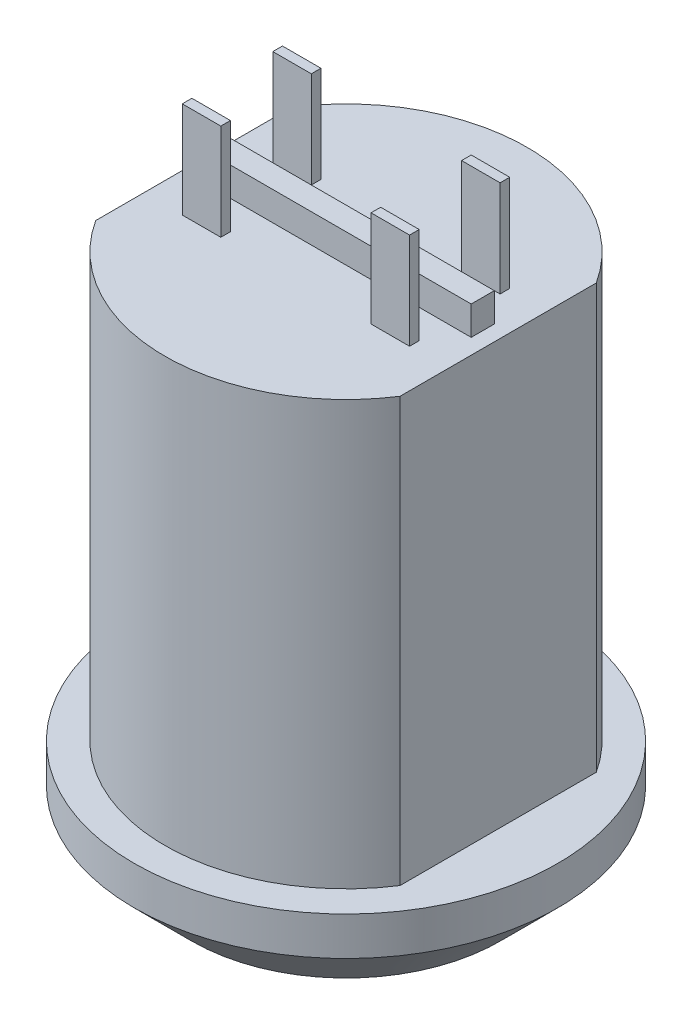
ISO-10303-21;
HEADER;
FILE_DESCRIPTION(('STEP AP214'),'2;1');
FILE_NAME('part.step','',(''),(''),'','','');
FILE_SCHEMA(('AUTOMOTIVE_DESIGN { 1 0 10303 214 1 1 1 1 }'));
ENDSEC;
DATA;
#1=APPLICATION_CONTEXT('core data for automotive mechanical design processes');
#2=APPLICATION_PROTOCOL_DEFINITION('international standard','automotive_design',2000,#1);
#3=PRODUCT_CONTEXT('',#1,'mechanical');
#4=PRODUCT('Part','Part','',(#3));
#5=PRODUCT_RELATED_PRODUCT_CATEGORY('part','',(#4));
#6=PRODUCT_DEFINITION_FORMATION('','',#4);
#7=PRODUCT_DEFINITION_CONTEXT('part definition',#1,'design');
#8=PRODUCT_DEFINITION('design','',#6,#7);
#9=PRODUCT_DEFINITION_SHAPE('','',#8);
#10=(LENGTH_UNIT() NAMED_UNIT(*) SI_UNIT(.MILLI.,.METRE.));
#11=(NAMED_UNIT(*) PLANE_ANGLE_UNIT() SI_UNIT($,.RADIAN.));
#12=(NAMED_UNIT(*) SI_UNIT($,.STERADIAN.) SOLID_ANGLE_UNIT());
#13=UNCERTAINTY_MEASURE_WITH_UNIT(LENGTH_MEASURE(1.E-05),#10,'distance_accuracy_value','');
#14=(GEOMETRIC_REPRESENTATION_CONTEXT(3) GLOBAL_UNCERTAINTY_ASSIGNED_CONTEXT((#13)) GLOBAL_UNIT_ASSIGNED_CONTEXT((#10,
#11,#12)) REPRESENTATION_CONTEXT('',''));
#15=CARTESIAN_POINT('',(0.,0.,0.));
#16=DIRECTION('',(0.,0.,1.));
#17=DIRECTION('',(1.,0.,0.));
#18=AXIS2_PLACEMENT_3D('',#15,#16,#17);
#19=CARTESIAN_POINT('',(0.,27.,0.));
#20=DIRECTION('',(0.,-1.,0.));
#21=DIRECTION('',(0.,0.,-1.));
#22=AXIS2_PLACEMENT_3D('',#19,#20,#21);
#23=PLANE('',#22);
#24=DIRECTION('',(1.,0.,0.));
#25=VECTOR('',#24,1.);
#26=CARTESIAN_POINT('',(-5.9,27.,2.6));
#27=LINE('',#26,#25);
#28=CARTESIAN_POINT('',(-5.9,27.,2.6));
#29=VERTEX_POINT('',#28);
#30=CARTESIAN_POINT('',(-3.9,27.,2.6));
#31=VERTEX_POINT('',#30);
#32=EDGE_CURVE('E239',#29,#31,#27,.T.);
#33=ORIENTED_EDGE('',*,*,#32,.F.);
#34=DIRECTION('',(0.,0.,1.));
#35=VECTOR('',#34,1.);
#36=CARTESIAN_POINT('',(-5.9,27.,2.6));
#37=LINE('',#36,#35);
#38=CARTESIAN_POINT('',(-5.9,27.,2.1));
#39=VERTEX_POINT('',#38);
#40=EDGE_CURVE('E252',#39,#29,#37,.T.);
#41=ORIENTED_EDGE('',*,*,#40,.F.);
#42=DIRECTION('',(-1.,0.,0.));
#43=VECTOR('',#42,1.);
#44=CARTESIAN_POINT('',(-5.9,27.,2.1));
#45=LINE('',#44,#43);
#46=CARTESIAN_POINT('',(-3.9,27.,2.1));
#47=VERTEX_POINT('',#46);
#48=EDGE_CURVE('E261',#47,#39,#45,.T.);
#49=ORIENTED_EDGE('',*,*,#48,.F.);
#50=DIRECTION('',(0.,0.,-1.));
#51=VECTOR('',#50,1.);
#52=CARTESIAN_POINT('',(-3.9,27.,2.6));
#53=LINE('',#52,#51);
#54=EDGE_CURVE('E242',#31,#47,#53,.T.);
#55=ORIENTED_EDGE('',*,*,#54,.F.);
#56=EDGE_LOOP('',(#33,#41,#49,#55));
#57=FACE_BOUND('',#56,.T.);
#58=DIRECTION('',(-1.,0.,0.));
#59=VECTOR('',#58,1.);
#60=CARTESIAN_POINT('',(5.9,27.,-2.6));
#61=LINE('',#60,#59);
#62=CARTESIAN_POINT('',(5.9,27.,-2.6));
#63=VERTEX_POINT('',#62);
#64=CARTESIAN_POINT('',(3.9,27.,-2.6));
#65=VERTEX_POINT('',#64);
#66=EDGE_CURVE('E310',#63,#65,#61,.T.);
#67=ORIENTED_EDGE('',*,*,#66,.F.);
#68=DIRECTION('',(0.,0.,-1.));
#69=VECTOR('',#68,1.);
#70=CARTESIAN_POINT('',(5.9,27.,-2.6));
#71=LINE('',#70,#69);
#72=CARTESIAN_POINT('',(5.9,27.,-2.1));
#73=VERTEX_POINT('',#72);
#74=EDGE_CURVE('E315',#73,#63,#71,.T.);
#75=ORIENTED_EDGE('',*,*,#74,.F.);
#76=DIRECTION('',(1.,0.,0.));
#77=VECTOR('',#76,1.);
#78=CARTESIAN_POINT('',(5.9,27.,-2.1));
#79=LINE('',#78,#77);
#80=CARTESIAN_POINT('',(3.9,27.,-2.1));
#81=VERTEX_POINT('',#80);
#82=EDGE_CURVE('E327',#81,#73,#79,.T.);
#83=ORIENTED_EDGE('',*,*,#82,.F.);
#84=DIRECTION('',(0.,0.,1.));
#85=VECTOR('',#84,1.);
#86=CARTESIAN_POINT('',(3.9,27.,-2.6));
#87=LINE('',#86,#85);
#88=EDGE_CURVE('E324',#65,#81,#87,.T.);
#89=ORIENTED_EDGE('',*,*,#88,.F.);
#90=EDGE_LOOP('',(#67,#75,#83,#89));
#91=FACE_BOUND('',#90,.T.);
#92=CARTESIAN_POINT('',(0.,27.,0.));
#93=DIRECTION('',(0.,1.,0.));
#94=DIRECTION('',(0.,0.,-1.));
#95=AXIS2_PLACEMENT_3D('',#92,#93,#94);
#96=CIRCLE('',#95,9.4);
#97=CARTESIAN_POINT('',(-7.9,27.,5.09411425078001));
#98=VERTEX_POINT('',#97);
#99=CARTESIAN_POINT('',(7.9,27.,5.09411425078001));
#100=VERTEX_POINT('',#99);
#101=EDGE_CURVE('E408',#98,#100,#96,.T.);
#102=ORIENTED_EDGE('',*,*,#101,.T.);
#103=DIRECTION('',(0.,0.,-1.));
#104=VECTOR('',#103,1.);
#105=CARTESIAN_POINT('',(7.9,27.,5.09411425078001));
#106=LINE('',#105,#104);
#107=CARTESIAN_POINT('',(7.9,27.,-5.09411425078001));
#108=VERTEX_POINT('',#107);
#109=EDGE_CURVE('E411',#100,#108,#106,.T.);
#110=ORIENTED_EDGE('',*,*,#109,.T.);
#111=CARTESIAN_POINT('',(0.,27.,0.));
#112=DIRECTION('',(0.,1.,0.));
#113=DIRECTION('',(0.,0.,1.));
#114=AXIS2_PLACEMENT_3D('',#111,#112,#113);
#115=CIRCLE('',#114,9.4);
#116=CARTESIAN_POINT('',(-7.90000000000001,27.,-5.09411425078001));
#117=VERTEX_POINT('',#116);
#118=EDGE_CURVE('E414',#108,#117,#115,.T.);
#119=ORIENTED_EDGE('',*,*,#118,.T.);
#120=DIRECTION('',(0.,0.,1.));
#121=VECTOR('',#120,1.);
#122=CARTESIAN_POINT('',(-7.9,27.,5.09411425078001));
#123=LINE('',#122,#121);
#124=EDGE_CURVE('E416',#117,#98,#123,.T.);
#125=ORIENTED_EDGE('',*,*,#124,.T.);
#126=EDGE_LOOP('',(#102,#110,#119,#125));
#127=FACE_BOUND('',#126,.T.);
#128=DIRECTION('',(0.,0.,1.));
#129=VECTOR('',#128,1.);
#130=CARTESIAN_POINT('',(-5.9,27.,-2.6));
#131=LINE('',#130,#129);
#132=CARTESIAN_POINT('',(-5.9,27.,-2.6));
#133=VERTEX_POINT('',#132);
#134=CARTESIAN_POINT('',(-5.9,27.,-2.1));
#135=VERTEX_POINT('',#134);
#136=EDGE_CURVE('E343',#133,#135,#131,.T.);
#137=ORIENTED_EDGE('',*,*,#136,.F.);
#138=DIRECTION('',(-1.,0.,0.));
#139=VECTOR('',#138,1.);
#140=CARTESIAN_POINT('',(-5.9,27.,-2.6));
#141=LINE('',#140,#139);
#142=CARTESIAN_POINT('',(-3.9,27.,-2.6));
#143=VERTEX_POINT('',#142);
#144=EDGE_CURVE('E348',#143,#133,#141,.T.);
#145=ORIENTED_EDGE('',*,*,#144,.F.);
#146=DIRECTION('',(0.,0.,-1.));
#147=VECTOR('',#146,1.);
#148=CARTESIAN_POINT('',(-3.9,27.,-2.6));
#149=LINE('',#148,#147);
#150=CARTESIAN_POINT('',(-3.9,27.,-2.1));
#151=VERTEX_POINT('',#150);
#152=EDGE_CURVE('E360',#151,#143,#149,.T.);
#153=ORIENTED_EDGE('',*,*,#152,.F.);
#154=DIRECTION('',(1.,0.,0.));
#155=VECTOR('',#154,1.);
#156=CARTESIAN_POINT('',(-5.9,27.,-2.1));
#157=LINE('',#156,#155);
#158=EDGE_CURVE('E357',#135,#151,#157,.T.);
#159=ORIENTED_EDGE('',*,*,#158,.F.);
#160=EDGE_LOOP('',(#137,#145,#153,#159));
#161=FACE_BOUND('',#160,.T.);
#162=DIRECTION('',(0.,0.,-1.));
#163=VECTOR('',#162,1.);
#164=CARTESIAN_POINT('',(5.9,27.,2.6));
#165=LINE('',#164,#163);
#166=CARTESIAN_POINT('',(5.9,27.,2.6));
#167=VERTEX_POINT('',#166);
#168=CARTESIAN_POINT('',(5.9,27.,2.1));
#169=VERTEX_POINT('',#168);
#170=EDGE_CURVE('E277',#167,#169,#165,.T.);
#171=ORIENTED_EDGE('',*,*,#170,.F.);
#172=DIRECTION('',(1.,0.,0.));
#173=VECTOR('',#172,1.);
#174=CARTESIAN_POINT('',(5.9,27.,2.6));
#175=LINE('',#174,#173);
#176=CARTESIAN_POINT('',(3.9,27.,2.6));
#177=VERTEX_POINT('',#176);
#178=EDGE_CURVE('E282',#177,#167,#175,.T.);
#179=ORIENTED_EDGE('',*,*,#178,.F.);
#180=DIRECTION('',(0.,0.,1.));
#181=VECTOR('',#180,1.);
#182=CARTESIAN_POINT('',(3.9,27.,2.6));
#183=LINE('',#182,#181);
#184=CARTESIAN_POINT('',(3.9,27.,2.1));
#185=VERTEX_POINT('',#184);
#186=EDGE_CURVE('E294',#185,#177,#183,.T.);
#187=ORIENTED_EDGE('',*,*,#186,.F.);
#188=DIRECTION('',(-1.,0.,0.));
#189=VECTOR('',#188,1.);
#190=CARTESIAN_POINT('',(5.9,27.,2.1));
#191=LINE('',#190,#189);
#192=EDGE_CURVE('E291',#169,#185,#191,.T.);
#193=ORIENTED_EDGE('',*,*,#192,.F.);
#194=EDGE_LOOP('',(#171,#179,#187,#193));
#195=FACE_BOUND('',#194,.T.);
#196=DIRECTION('',(0.,0.,1.));
#197=VECTOR('',#196,1.);
#198=CARTESIAN_POINT('',(-7.1,27.,-0.6));
#199=LINE('',#198,#197);
#200=CARTESIAN_POINT('',(-7.1,27.,-0.6));
#201=VERTEX_POINT('',#200);
#202=CARTESIAN_POINT('',(-7.1,27.,0.6));
#203=VERTEX_POINT('',#202);
#204=EDGE_CURVE('E238',#201,#203,#199,.T.);
#205=ORIENTED_EDGE('',*,*,#204,.F.);
#206=DIRECTION('',(-1.,0.,0.));
#207=VECTOR('',#206,1.);
#208=CARTESIAN_POINT('',(-7.1,27.,-0.6));
#209=LINE('',#208,#207);
#210=CARTESIAN_POINT('',(7.1,27.,-0.600000000000002));
#211=VERTEX_POINT('',#210);
#212=EDGE_CURVE('E235',#211,#201,#209,.T.);
#213=ORIENTED_EDGE('',*,*,#212,.F.);
#214=DIRECTION('',(0.,0.,-1.));
#215=VECTOR('',#214,1.);
#216=CARTESIAN_POINT('',(7.1,27.,-0.600000000000002));
#217=LINE('',#216,#215);
#218=CARTESIAN_POINT('',(7.1,27.,0.599999999999998));
#219=VERTEX_POINT('',#218);
#220=EDGE_CURVE('E53',#219,#211,#217,.T.);
#221=ORIENTED_EDGE('',*,*,#220,.F.);
#222=DIRECTION('',(1.,0.,0.));
#223=VECTOR('',#222,1.);
#224=CARTESIAN_POINT('',(-7.1,27.,0.6));
#225=LINE('',#224,#223);
#226=EDGE_CURVE('E48',#203,#219,#225,.T.);
#227=ORIENTED_EDGE('',*,*,#226,.F.);
#228=EDGE_LOOP('',(#205,#213,#221,#227));
#229=FACE_BOUND('',#228,.T.);
#230=ADVANCED_FACE('F33',(#57,#91,#127,#161,#195,#229),#23,.F.);
#231=CARTESIAN_POINT('',(0.,0.,0.));
#232=DIRECTION('',(0.,1.,0.));
#233=DIRECTION('',(0.,0.,1.));
#234=AXIS2_PLACEMENT_3D('',#231,#232,#233);
#235=PLANE('',#234);
#236=CARTESIAN_POINT('',(0.,0.,0.));
#237=DIRECTION('',(0.,1.,0.));
#238=DIRECTION('',(0.,0.,1.));
#239=AXIS2_PLACEMENT_3D('',#236,#237,#238);
#240=CIRCLE('',#239,7.99999999999999);
#241=CARTESIAN_POINT('',(0.,0.,7.99999999999999));
#242=VERTEX_POINT('',#241);
#243=EDGE_CURVE('E11',#242,#242,#240,.F.);
#244=ORIENTED_EDGE('',*,*,#243,.T.);
#245=EDGE_LOOP('',(#244));
#246=FACE_BOUND('',#245,.T.);
#247=DIRECTION('',(0.,0.,1.));
#248=VECTOR('',#247,1.);
#249=CARTESIAN_POINT('',(-1.,0.,-3.75));
#250=LINE('',#249,#248);
#251=CARTESIAN_POINT('',(-1.,0.,-3.75));
#252=VERTEX_POINT('',#251);
#253=CARTESIAN_POINT('',(-0.999999999999999,0.,3.75));
#254=VERTEX_POINT('',#253);
#255=EDGE_CURVE('E376',#252,#254,#250,.T.);
#256=ORIENTED_EDGE('',*,*,#255,.T.);
#257=DIRECTION('',(1.,0.,0.));
#258=VECTOR('',#257,1.);
#259=CARTESIAN_POINT('',(-0.999999999999999,0.,3.75));
#260=LINE('',#259,#258);
#261=CARTESIAN_POINT('',(0.999999999999999,0.,3.75));
#262=VERTEX_POINT('',#261);
#263=EDGE_CURVE('E390',#254,#262,#260,.T.);
#264=ORIENTED_EDGE('',*,*,#263,.T.);
#265=DIRECTION('',(0.,0.,-1.));
#266=VECTOR('',#265,1.);
#267=CARTESIAN_POINT('',(1.,0.,-3.75));
#268=LINE('',#267,#266);
#269=CARTESIAN_POINT('',(1.,0.,-3.75));
#270=VERTEX_POINT('',#269);
#271=EDGE_CURVE('E393',#262,#270,#268,.T.);
#272=ORIENTED_EDGE('',*,*,#271,.T.);
#273=DIRECTION('',(-1.,0.,0.));
#274=VECTOR('',#273,1.);
#275=CARTESIAN_POINT('',(-1.,0.,-3.75));
#276=LINE('',#275,#274);
#277=EDGE_CURVE('E381',#270,#252,#276,.T.);
#278=ORIENTED_EDGE('',*,*,#277,.T.);
#279=EDGE_LOOP('',(#256,#264,#272,#278));
#280=FACE_BOUND('',#279,.T.);
#281=ADVANCED_FACE('F457',(#246,#280),#235,.F.);
#282=CARTESIAN_POINT('',(0.,5.,0.));
#283=DIRECTION('',(0.,1.,0.));
#284=DIRECTION('',(0.,0.,1.));
#285=AXIS2_PLACEMENT_3D('',#282,#283,#284);
#286=PLANE('',#285);
#287=CARTESIAN_POINT('',(0.,5.,0.));
#288=DIRECTION('',(0.,1.,0.));
#289=DIRECTION('',(0.,0.,1.));
#290=AXIS2_PLACEMENT_3D('',#287,#288,#289);
#291=CIRCLE('',#290,11.);
#292=CARTESIAN_POINT('',(0.,5.,11.));
#293=VERTEX_POINT('',#292);
#294=EDGE_CURVE('E436',#293,#293,#291,.T.);
#295=ORIENTED_EDGE('',*,*,#294,.T.);
#296=EDGE_LOOP('',(#295));
#297=FACE_BOUND('',#296,.T.);
#298=DIRECTION('',(0.,0.,-1.));
#299=VECTOR('',#298,1.);
#300=CARTESIAN_POINT('',(7.9,5.,5.09411425078001));
#301=LINE('',#300,#299);
#302=CARTESIAN_POINT('',(7.9,5.,5.09411425078001));
#303=VERTEX_POINT('',#302);
#304=CARTESIAN_POINT('',(7.9,5.,-5.09411425078001));
#305=VERTEX_POINT('',#304);
#306=EDGE_CURVE('E421',#303,#305,#301,.T.);
#307=ORIENTED_EDGE('',*,*,#306,.F.);
#308=CARTESIAN_POINT('',(0.,5.,0.));
#309=DIRECTION('',(0.,1.,0.));
#310=DIRECTION('',(0.,0.,-1.));
#311=AXIS2_PLACEMENT_3D('',#308,#309,#310);
#312=CIRCLE('',#311,9.4);
#313=CARTESIAN_POINT('',(-7.9,5.,5.09411425078001));
#314=VERTEX_POINT('',#313);
#315=EDGE_CURVE('E407',#314,#303,#312,.T.);
#316=ORIENTED_EDGE('',*,*,#315,.F.);
#317=DIRECTION('',(0.,0.,1.));
#318=VECTOR('',#317,1.);
#319=CARTESIAN_POINT('',(-7.9,5.,5.09411425078001));
#320=LINE('',#319,#318);
#321=CARTESIAN_POINT('',(-7.9,5.,-5.09411425078001));
#322=VERTEX_POINT('',#321);
#323=EDGE_CURVE('E412',#322,#314,#320,.T.);
#324=ORIENTED_EDGE('',*,*,#323,.F.);
#325=CARTESIAN_POINT('',(0.,5.,0.));
#326=DIRECTION('',(0.,1.,0.));
#327=DIRECTION('',(0.,0.,1.));
#328=AXIS2_PLACEMENT_3D('',#325,#326,#327);
#329=CIRCLE('',#328,9.4);
#330=EDGE_CURVE('E423',#305,#322,#329,.T.);
#331=ORIENTED_EDGE('',*,*,#330,.F.);
#332=EDGE_LOOP('',(#307,#316,#324,#331));
#333=FACE_BOUND('',#332,.T.);
#334=ADVANCED_FACE('F454',(#297,#333),#286,.T.);
#335=CARTESIAN_POINT('',(0.,5.,0.));
#336=DIRECTION('',(0.,-1.,0.));
#337=DIRECTION('',(0.,0.,-1.));
#338=AXIS2_PLACEMENT_3D('',#335,#336,#337);
#339=CYLINDRICAL_SURFACE('',#338,11.);
#340=CARTESIAN_POINT('',(0.,3.,0.));
#341=DIRECTION('',(0.,1.,0.));
#342=DIRECTION('',(0.,0.,1.));
#343=AXIS2_PLACEMENT_3D('',#340,#341,#342);
#344=CIRCLE('',#343,11.);
#345=CARTESIAN_POINT('',(0.,3.,11.));
#346=VERTEX_POINT('',#345);
#347=EDGE_CURVE('E41',#346,#346,#344,.T.);
#348=ORIENTED_EDGE('',*,*,#347,.T.);
#349=EDGE_LOOP('',(#348));
#350=FACE_BOUND('',#349,.T.);
#351=ORIENTED_EDGE('',*,*,#294,.F.);
#352=EDGE_LOOP('',(#351));
#353=FACE_BOUND('',#352,.T.);
#354=ADVANCED_FACE('F441',(#350,#353),#339,.T.);
#355=CARTESIAN_POINT('',(0.,3.,0.));
#356=DIRECTION('',(0.,1.,0.));
#357=DIRECTION('',(0.,0.,1.));
#358=AXIS2_PLACEMENT_3D('',#355,#356,#357);
#359=CONICAL_SURFACE('',#358,11.,0.78539816339745);
#360=ORIENTED_EDGE('',*,*,#243,.F.);
#361=EDGE_LOOP('',(#360));
#362=FACE_BOUND('',#361,.T.);
#363=ORIENTED_EDGE('',*,*,#347,.F.);
#364=EDGE_LOOP('',(#363));
#365=FACE_BOUND('',#364,.T.);
#366=ADVANCED_FACE('F35',(#362,#365),#359,.T.);
#367=CARTESIAN_POINT('',(0.,27.,0.));
#368=DIRECTION('',(0.,-1.,0.));
#369=DIRECTION('',(0.,0.,-1.));
#370=AXIS2_PLACEMENT_3D('',#367,#368,#369);
#371=CYLINDRICAL_SURFACE('',#370,9.4);
#372=ORIENTED_EDGE('',*,*,#315,.T.);
#373=DIRECTION('',(0.,-1.,0.));
#374=VECTOR('',#373,1.);
#375=CARTESIAN_POINT('',(7.9,27.,5.09411425078001));
#376=LINE('',#375,#374);
#377=EDGE_CURVE('E434',#100,#303,#376,.T.);
#378=ORIENTED_EDGE('',*,*,#377,.F.);
#379=ORIENTED_EDGE('',*,*,#101,.F.);
#380=DIRECTION('',(0.,-1.,0.));
#381=VECTOR('',#380,1.);
#382=CARTESIAN_POINT('',(-7.9,27.,5.09411425078001));
#383=LINE('',#382,#381);
#384=EDGE_CURVE('E418',#98,#314,#383,.T.);
#385=ORIENTED_EDGE('',*,*,#384,.T.);
#386=EDGE_LOOP('',(#372,#378,#379,#385));
#387=FACE_BOUND('',#386,.T.);
#388=ADVANCED_FACE('F445',(#387),#371,.T.);
#389=CARTESIAN_POINT('',(7.9,27.,5.09411425078001));
#390=DIRECTION('',(-1.,0.,0.));
#391=DIRECTION('',(0.,0.,1.));
#392=AXIS2_PLACEMENT_3D('',#389,#390,#391);
#393=PLANE('',#392);
#394=ORIENTED_EDGE('',*,*,#306,.T.);
#395=DIRECTION('',(0.,-1.,0.));
#396=VECTOR('',#395,1.);
#397=CARTESIAN_POINT('',(7.9,27.,-5.09411425078001));
#398=LINE('',#397,#396);
#399=EDGE_CURVE('E431',#108,#305,#398,.T.);
#400=ORIENTED_EDGE('',*,*,#399,.F.);
#401=ORIENTED_EDGE('',*,*,#109,.F.);
#402=ORIENTED_EDGE('',*,*,#377,.T.);
#403=EDGE_LOOP('',(#394,#400,#401,#402));
#404=FACE_BOUND('',#403,.T.);
#405=ADVANCED_FACE('F451',(#404),#393,.F.);
#406=CARTESIAN_POINT('',(0.,27.,0.));
#407=DIRECTION('',(0.,-1.,0.));
#408=DIRECTION('',(0.,0.,-1.));
#409=AXIS2_PLACEMENT_3D('',#406,#407,#408);
#410=CYLINDRICAL_SURFACE('',#409,9.4);
#411=ORIENTED_EDGE('',*,*,#330,.T.);
#412=DIRECTION('',(0.,-1.,0.));
#413=VECTOR('',#412,1.);
#414=CARTESIAN_POINT('',(-7.90000000000001,27.,-5.09411425078001));
#415=LINE('',#414,#413);
#416=EDGE_CURVE('E429',#117,#322,#415,.T.);
#417=ORIENTED_EDGE('',*,*,#416,.F.);
#418=ORIENTED_EDGE('',*,*,#118,.F.);
#419=ORIENTED_EDGE('',*,*,#399,.T.);
#420=EDGE_LOOP('',(#411,#417,#418,#419));
#421=FACE_BOUND('',#420,.T.);
#422=ADVANCED_FACE('F473',(#421),#410,.T.);
#423=CARTESIAN_POINT('',(-7.9,27.,5.09411425078001));
#424=DIRECTION('',(1.,0.,0.));
#425=DIRECTION('',(0.,0.,-1.));
#426=AXIS2_PLACEMENT_3D('',#423,#424,#425);
#427=PLANE('',#426);
#428=ORIENTED_EDGE('',*,*,#323,.T.);
#429=ORIENTED_EDGE('',*,*,#384,.F.);
#430=ORIENTED_EDGE('',*,*,#124,.F.);
#431=ORIENTED_EDGE('',*,*,#416,.T.);
#432=EDGE_LOOP('',(#428,#429,#430,#431));
#433=FACE_BOUND('',#432,.T.);
#434=ADVANCED_FACE('F470',(#433),#427,.F.);
#435=CARTESIAN_POINT('',(-1.,10.,-3.75));
#436=DIRECTION('',(1.,0.,0.));
#437=DIRECTION('',(0.,0.,-1.));
#438=AXIS2_PLACEMENT_3D('',#435,#436,#437);
#439=PLANE('',#438);
#440=ORIENTED_EDGE('',*,*,#255,.F.);
#441=DIRECTION('',(0.,-1.,0.));
#442=VECTOR('',#441,1.);
#443=CARTESIAN_POINT('',(-1.,10.,-3.75));
#444=LINE('',#443,#442);
#445=CARTESIAN_POINT('',(-1.,10.,-3.75));
#446=VERTEX_POINT('',#445);
#447=EDGE_CURVE('E387',#446,#252,#444,.T.);
#448=ORIENTED_EDGE('',*,*,#447,.F.);
#449=DIRECTION('',(0.,0.,1.));
#450=VECTOR('',#449,1.);
#451=CARTESIAN_POINT('',(-1.,10.,-3.75));
#452=LINE('',#451,#450);
#453=CARTESIAN_POINT('',(-0.999999999999999,10.,3.75));
#454=VERTEX_POINT('',#453);
#455=EDGE_CURVE('E377',#446,#454,#452,.T.);
#456=ORIENTED_EDGE('',*,*,#455,.T.);
#457=DIRECTION('',(0.,-1.,0.));
#458=VECTOR('',#457,1.);
#459=CARTESIAN_POINT('',(-0.999999999999999,10.,3.75));
#460=LINE('',#459,#458);
#461=EDGE_CURVE('E404',#454,#254,#460,.T.);
#462=ORIENTED_EDGE('',*,*,#461,.T.);
#463=EDGE_LOOP('',(#440,#448,#456,#462));
#464=FACE_BOUND('',#463,.T.);
#465=ADVANCED_FACE('F468',(#464),#439,.T.);
#466=CARTESIAN_POINT('',(-0.999999999999999,10.,3.75));
#467=DIRECTION('',(0.,0.,-1.));
#468=DIRECTION('',(-1.,0.,0.));
#469=AXIS2_PLACEMENT_3D('',#466,#467,#468);
#470=PLANE('',#469);
#471=ORIENTED_EDGE('',*,*,#263,.F.);
#472=ORIENTED_EDGE('',*,*,#461,.F.);
#473=DIRECTION('',(1.,0.,0.));
#474=VECTOR('',#473,1.);
#475=CARTESIAN_POINT('',(-0.999999999999999,10.,3.75));
#476=LINE('',#475,#474);
#477=CARTESIAN_POINT('',(0.999999999999999,10.,3.75));
#478=VERTEX_POINT('',#477);
#479=EDGE_CURVE('E380',#454,#478,#476,.T.);
#480=ORIENTED_EDGE('',*,*,#479,.T.);
#481=DIRECTION('',(0.,-1.,0.));
#482=VECTOR('',#481,1.);
#483=CARTESIAN_POINT('',(0.999999999999999,10.,3.75));
#484=LINE('',#483,#482);
#485=EDGE_CURVE('E402',#478,#262,#484,.T.);
#486=ORIENTED_EDGE('',*,*,#485,.T.);
#487=EDGE_LOOP('',(#471,#472,#480,#486));
#488=FACE_BOUND('',#487,.T.);
#489=ADVANCED_FACE('F618',(#488),#470,.T.);
#490=CARTESIAN_POINT('',(1.,10.,-3.75));
#491=DIRECTION('',(-1.,0.,0.));
#492=DIRECTION('',(0.,0.,1.));
#493=AXIS2_PLACEMENT_3D('',#490,#491,#492);
#494=PLANE('',#493);
#495=ORIENTED_EDGE('',*,*,#271,.F.);
#496=ORIENTED_EDGE('',*,*,#485,.F.);
#497=DIRECTION('',(0.,0.,-1.));
#498=VECTOR('',#497,1.);
#499=CARTESIAN_POINT('',(1.,10.,-3.75));
#500=LINE('',#499,#498);
#501=CARTESIAN_POINT('',(1.,10.,-3.75));
#502=VERTEX_POINT('',#501);
#503=EDGE_CURVE('E383',#478,#502,#500,.T.);
#504=ORIENTED_EDGE('',*,*,#503,.T.);
#505=DIRECTION('',(0.,-1.,0.));
#506=VECTOR('',#505,1.);
#507=CARTESIAN_POINT('',(1.,10.,-3.75));
#508=LINE('',#507,#506);
#509=EDGE_CURVE('E400',#502,#270,#508,.T.);
#510=ORIENTED_EDGE('',*,*,#509,.T.);
#511=EDGE_LOOP('',(#495,#496,#504,#510));
#512=FACE_BOUND('',#511,.T.);
#513=ADVANCED_FACE('F615',(#512),#494,.T.);
#514=CARTESIAN_POINT('',(-1.,10.,-3.75));
#515=DIRECTION('',(0.,0.,1.));
#516=DIRECTION('',(1.,0.,0.));
#517=AXIS2_PLACEMENT_3D('',#514,#515,#516);
#518=PLANE('',#517);
#519=ORIENTED_EDGE('',*,*,#277,.F.);
#520=ORIENTED_EDGE('',*,*,#509,.F.);
#521=DIRECTION('',(-1.,0.,0.));
#522=VECTOR('',#521,1.);
#523=CARTESIAN_POINT('',(-1.,10.,-3.75));
#524=LINE('',#523,#522);
#525=EDGE_CURVE('E385',#502,#446,#524,.T.);
#526=ORIENTED_EDGE('',*,*,#525,.T.);
#527=ORIENTED_EDGE('',*,*,#447,.T.);
#528=EDGE_LOOP('',(#519,#520,#526,#527));
#529=FACE_BOUND('',#528,.T.);
#530=ADVANCED_FACE('F611',(#529),#518,.T.);
#531=CARTESIAN_POINT('',(-0.999999999999999,10.,3.75));
#532=DIRECTION('',(0.,1.,0.));
#533=DIRECTION('',(0.,0.,1.));
#534=AXIS2_PLACEMENT_3D('',#531,#532,#533);
#535=PLANE('',#534);
#536=ORIENTED_EDGE('',*,*,#455,.F.);
#537=ORIENTED_EDGE('',*,*,#525,.F.);
#538=ORIENTED_EDGE('',*,*,#503,.F.);
#539=ORIENTED_EDGE('',*,*,#479,.F.);
#540=EDGE_LOOP('',(#536,#537,#538,#539));
#541=FACE_BOUND('',#540,.T.);
#542=ADVANCED_FACE('F607',(#541),#535,.F.);
#543=CARTESIAN_POINT('',(-5.9,32.,-2.6));
#544=DIRECTION('',(1.,0.,0.));
#545=DIRECTION('',(0.,0.,-1.));
#546=AXIS2_PLACEMENT_3D('',#543,#544,#545);
#547=PLANE('',#546);
#548=ORIENTED_EDGE('',*,*,#136,.T.);
#549=DIRECTION('',(0.,-1.,0.));
#550=VECTOR('',#549,1.);
#551=CARTESIAN_POINT('',(-5.9,32.,-2.1));
#552=LINE('',#551,#550);
#553=CARTESIAN_POINT('',(-5.9,32.,-2.1));
#554=VERTEX_POINT('',#553);
#555=EDGE_CURVE('E373',#554,#135,#552,.T.);
#556=ORIENTED_EDGE('',*,*,#555,.F.);
#557=DIRECTION('',(0.,0.,1.));
#558=VECTOR('',#557,1.);
#559=CARTESIAN_POINT('',(-5.9,32.,-2.6));
#560=LINE('',#559,#558);
#561=CARTESIAN_POINT('',(-5.9,32.,-2.6));
#562=VERTEX_POINT('',#561);
#563=EDGE_CURVE('E344',#562,#554,#560,.T.);
#564=ORIENTED_EDGE('',*,*,#563,.F.);
#565=DIRECTION('',(0.,-1.,0.));
#566=VECTOR('',#565,1.);
#567=CARTESIAN_POINT('',(-5.9,32.,-2.6));
#568=LINE('',#567,#566);
#569=EDGE_CURVE('E354',#562,#133,#568,.T.);
#570=ORIENTED_EDGE('',*,*,#569,.T.);
#571=EDGE_LOOP('',(#548,#556,#564,#570));
#572=FACE_BOUND('',#571,.T.);
#573=ADVANCED_FACE('F603',(#572),#547,.F.);
#574=CARTESIAN_POINT('',(-5.9,32.,-2.1));
#575=DIRECTION('',(0.,0.,-1.));
#576=DIRECTION('',(-1.,0.,0.));
#577=AXIS2_PLACEMENT_3D('',#574,#575,#576);
#578=PLANE('',#577);
#579=ORIENTED_EDGE('',*,*,#158,.T.);
#580=DIRECTION('',(0.,-1.,0.));
#581=VECTOR('',#580,1.);
#582=CARTESIAN_POINT('',(-3.9,32.,-2.1));
#583=LINE('',#582,#581);
#584=CARTESIAN_POINT('',(-3.9,32.,-2.1));
#585=VERTEX_POINT('',#584);
#586=EDGE_CURVE('E370',#585,#151,#583,.T.);
#587=ORIENTED_EDGE('',*,*,#586,.F.);
#588=DIRECTION('',(1.,0.,0.));
#589=VECTOR('',#588,1.);
#590=CARTESIAN_POINT('',(-5.9,32.,-2.1));
#591=LINE('',#590,#589);
#592=EDGE_CURVE('E347',#554,#585,#591,.T.);
#593=ORIENTED_EDGE('',*,*,#592,.F.);
#594=ORIENTED_EDGE('',*,*,#555,.T.);
#595=EDGE_LOOP('',(#579,#587,#593,#594));
#596=FACE_BOUND('',#595,.T.);
#597=ADVANCED_FACE('F599',(#596),#578,.F.);
#598=CARTESIAN_POINT('',(-3.9,32.,-2.6));
#599=DIRECTION('',(-1.,0.,0.));
#600=DIRECTION('',(0.,0.,1.));
#601=AXIS2_PLACEMENT_3D('',#598,#599,#600);
#602=PLANE('',#601);
#603=ORIENTED_EDGE('',*,*,#152,.T.);
#604=DIRECTION('',(0.,-1.,0.));
#605=VECTOR('',#604,1.);
#606=CARTESIAN_POINT('',(-3.9,32.,-2.6));
#607=LINE('',#606,#605);
#608=CARTESIAN_POINT('',(-3.9,32.,-2.6));
#609=VERTEX_POINT('',#608);
#610=EDGE_CURVE('E367',#609,#143,#607,.T.);
#611=ORIENTED_EDGE('',*,*,#610,.F.);
#612=DIRECTION('',(0.,0.,-1.));
#613=VECTOR('',#612,1.);
#614=CARTESIAN_POINT('',(-3.9,32.,-2.6));
#615=LINE('',#614,#613);
#616=EDGE_CURVE('E350',#585,#609,#615,.T.);
#617=ORIENTED_EDGE('',*,*,#616,.F.);
#618=ORIENTED_EDGE('',*,*,#586,.T.);
#619=EDGE_LOOP('',(#603,#611,#617,#618));
#620=FACE_BOUND('',#619,.T.);
#621=ADVANCED_FACE('F595',(#620),#602,.F.);
#622=CARTESIAN_POINT('',(-5.9,32.,-2.6));
#623=DIRECTION('',(0.,0.,1.));
#624=DIRECTION('',(1.,0.,0.));
#625=AXIS2_PLACEMENT_3D('',#622,#623,#624);
#626=PLANE('',#625);
#627=ORIENTED_EDGE('',*,*,#144,.T.);
#628=ORIENTED_EDGE('',*,*,#569,.F.);
#629=DIRECTION('',(-1.,0.,0.));
#630=VECTOR('',#629,1.);
#631=CARTESIAN_POINT('',(-5.9,32.,-2.6));
#632=LINE('',#631,#630);
#633=EDGE_CURVE('E352',#609,#562,#632,.T.);
#634=ORIENTED_EDGE('',*,*,#633,.F.);
#635=ORIENTED_EDGE('',*,*,#610,.T.);
#636=EDGE_LOOP('',(#627,#628,#634,#635));
#637=FACE_BOUND('',#636,.T.);
#638=ADVANCED_FACE('F591',(#637),#626,.F.);
#639=CARTESIAN_POINT('',(0.,32.,0.));
#640=DIRECTION('',(0.,1.,0.));
#641=DIRECTION('',(0.,0.,1.));
#642=AXIS2_PLACEMENT_3D('',#639,#640,#641);
#643=PLANE('',#642);
#644=ORIENTED_EDGE('',*,*,#563,.T.);
#645=ORIENTED_EDGE('',*,*,#592,.T.);
#646=ORIENTED_EDGE('',*,*,#616,.T.);
#647=ORIENTED_EDGE('',*,*,#633,.T.);
#648=EDGE_LOOP('',(#644,#645,#646,#647));
#649=FACE_BOUND('',#648,.T.);
#650=ADVANCED_FACE('F587',(#649),#643,.T.);
#651=CARTESIAN_POINT('',(5.9,32.,-2.6));
#652=DIRECTION('',(0.,0.,1.));
#653=DIRECTION('',(1.,0.,0.));
#654=AXIS2_PLACEMENT_3D('',#651,#652,#653);
#655=PLANE('',#654);
#656=ORIENTED_EDGE('',*,*,#66,.T.);
#657=DIRECTION('',(0.,-1.,0.));
#658=VECTOR('',#657,1.);
#659=CARTESIAN_POINT('',(3.9,32.,-2.6));
#660=LINE('',#659,#658);
#661=CARTESIAN_POINT('',(3.9,32.,-2.6));
#662=VERTEX_POINT('',#661);
#663=EDGE_CURVE('E340',#662,#65,#660,.T.);
#664=ORIENTED_EDGE('',*,*,#663,.F.);
#665=DIRECTION('',(-1.,0.,0.));
#666=VECTOR('',#665,1.);
#667=CARTESIAN_POINT('',(5.9,32.,-2.6));
#668=LINE('',#667,#666);
#669=CARTESIAN_POINT('',(5.9,32.,-2.6));
#670=VERTEX_POINT('',#669);
#671=EDGE_CURVE('E311',#670,#662,#668,.T.);
#672=ORIENTED_EDGE('',*,*,#671,.F.);
#673=DIRECTION('',(0.,-1.,0.));
#674=VECTOR('',#673,1.);
#675=CARTESIAN_POINT('',(5.9,32.,-2.6));
#676=LINE('',#675,#674);
#677=EDGE_CURVE('E321',#670,#63,#676,.T.);
#678=ORIENTED_EDGE('',*,*,#677,.T.);
#679=EDGE_LOOP('',(#656,#664,#672,#678));
#680=FACE_BOUND('',#679,.T.);
#681=ADVANCED_FACE('F583',(#680),#655,.F.);
#682=CARTESIAN_POINT('',(3.9,32.,-2.6));
#683=DIRECTION('',(1.,0.,0.));
#684=DIRECTION('',(0.,0.,-1.));
#685=AXIS2_PLACEMENT_3D('',#682,#683,#684);
#686=PLANE('',#685);
#687=ORIENTED_EDGE('',*,*,#88,.T.);
#688=DIRECTION('',(0.,-1.,0.));
#689=VECTOR('',#688,1.);
#690=CARTESIAN_POINT('',(3.9,32.,-2.1));
#691=LINE('',#690,#689);
#692=CARTESIAN_POINT('',(3.9,32.,-2.1));
#693=VERTEX_POINT('',#692);
#694=EDGE_CURVE('E337',#693,#81,#691,.T.);
#695=ORIENTED_EDGE('',*,*,#694,.F.);
#696=DIRECTION('',(0.,0.,1.));
#697=VECTOR('',#696,1.);
#698=CARTESIAN_POINT('',(3.9,32.,-2.6));
#699=LINE('',#698,#697);
#700=EDGE_CURVE('E314',#662,#693,#699,.T.);
#701=ORIENTED_EDGE('',*,*,#700,.F.);
#702=ORIENTED_EDGE('',*,*,#663,.T.);
#703=EDGE_LOOP('',(#687,#695,#701,#702));
#704=FACE_BOUND('',#703,.T.);
#705=ADVANCED_FACE('F579',(#704),#686,.F.);
#706=CARTESIAN_POINT('',(5.9,32.,-2.1));
#707=DIRECTION('',(0.,0.,-1.));
#708=DIRECTION('',(-1.,0.,0.));
#709=AXIS2_PLACEMENT_3D('',#706,#707,#708);
#710=PLANE('',#709);
#711=ORIENTED_EDGE('',*,*,#82,.T.);
#712=DIRECTION('',(0.,-1.,0.));
#713=VECTOR('',#712,1.);
#714=CARTESIAN_POINT('',(5.9,32.,-2.1));
#715=LINE('',#714,#713);
#716=CARTESIAN_POINT('',(5.9,32.,-2.1));
#717=VERTEX_POINT('',#716);
#718=EDGE_CURVE('E334',#717,#73,#715,.T.);
#719=ORIENTED_EDGE('',*,*,#718,.F.);
#720=DIRECTION('',(1.,0.,0.));
#721=VECTOR('',#720,1.);
#722=CARTESIAN_POINT('',(5.9,32.,-2.1));
#723=LINE('',#722,#721);
#724=EDGE_CURVE('E317',#693,#717,#723,.T.);
#725=ORIENTED_EDGE('',*,*,#724,.F.);
#726=ORIENTED_EDGE('',*,*,#694,.T.);
#727=EDGE_LOOP('',(#711,#719,#725,#726));
#728=FACE_BOUND('',#727,.T.);
#729=ADVANCED_FACE('F575',(#728),#710,.F.);
#730=CARTESIAN_POINT('',(5.9,32.,-2.6));
#731=DIRECTION('',(-1.,0.,0.));
#732=DIRECTION('',(0.,0.,1.));
#733=AXIS2_PLACEMENT_3D('',#730,#731,#732);
#734=PLANE('',#733);
#735=ORIENTED_EDGE('',*,*,#74,.T.);
#736=ORIENTED_EDGE('',*,*,#677,.F.);
#737=DIRECTION('',(0.,0.,-1.));
#738=VECTOR('',#737,1.);
#739=CARTESIAN_POINT('',(5.9,32.,-2.6));
#740=LINE('',#739,#738);
#741=EDGE_CURVE('E319',#717,#670,#740,.T.);
#742=ORIENTED_EDGE('',*,*,#741,.F.);
#743=ORIENTED_EDGE('',*,*,#718,.T.);
#744=EDGE_LOOP('',(#735,#736,#742,#743));
#745=FACE_BOUND('',#744,.T.);
#746=ADVANCED_FACE('F571',(#745),#734,.F.);
#747=CARTESIAN_POINT('',(0.,32.,0.));
#748=DIRECTION('',(0.,1.,0.));
#749=DIRECTION('',(0.,0.,1.));
#750=AXIS2_PLACEMENT_3D('',#747,#748,#749);
#751=PLANE('',#750);
#752=ORIENTED_EDGE('',*,*,#671,.T.);
#753=ORIENTED_EDGE('',*,*,#700,.T.);
#754=ORIENTED_EDGE('',*,*,#724,.T.);
#755=ORIENTED_EDGE('',*,*,#741,.T.);
#756=EDGE_LOOP('',(#752,#753,#754,#755));
#757=FACE_BOUND('',#756,.T.);
#758=ADVANCED_FACE('F567',(#757),#751,.T.);
#759=CARTESIAN_POINT('',(5.9,32.,2.6));
#760=DIRECTION('',(-1.,0.,0.));
#761=DIRECTION('',(0.,0.,1.));
#762=AXIS2_PLACEMENT_3D('',#759,#760,#761);
#763=PLANE('',#762);
#764=ORIENTED_EDGE('',*,*,#170,.T.);
#765=DIRECTION('',(0.,-1.,0.));
#766=VECTOR('',#765,1.);
#767=CARTESIAN_POINT('',(5.9,32.,2.1));
#768=LINE('',#767,#766);
#769=CARTESIAN_POINT('',(5.9,32.,2.1));
#770=VERTEX_POINT('',#769);
#771=EDGE_CURVE('E307',#770,#169,#768,.T.);
#772=ORIENTED_EDGE('',*,*,#771,.F.);
#773=DIRECTION('',(0.,0.,-1.));
#774=VECTOR('',#773,1.);
#775=CARTESIAN_POINT('',(5.9,32.,2.6));
#776=LINE('',#775,#774);
#777=CARTESIAN_POINT('',(5.9,32.,2.6));
#778=VERTEX_POINT('',#777);
#779=EDGE_CURVE('E278',#778,#770,#776,.T.);
#780=ORIENTED_EDGE('',*,*,#779,.F.);
#781=DIRECTION('',(0.,-1.,0.));
#782=VECTOR('',#781,1.);
#783=CARTESIAN_POINT('',(5.9,32.,2.6));
#784=LINE('',#783,#782);
#785=EDGE_CURVE('E288',#778,#167,#784,.T.);
#786=ORIENTED_EDGE('',*,*,#785,.T.);
#787=EDGE_LOOP('',(#764,#772,#780,#786));
#788=FACE_BOUND('',#787,.T.);
#789=ADVANCED_FACE('F563',(#788),#763,.F.);
#790=CARTESIAN_POINT('',(5.9,32.,2.1));
#791=DIRECTION('',(0.,0.,1.));
#792=DIRECTION('',(1.,0.,0.));
#793=AXIS2_PLACEMENT_3D('',#790,#791,#792);
#794=PLANE('',#793);
#795=ORIENTED_EDGE('',*,*,#192,.T.);
#796=DIRECTION('',(0.,-1.,0.));
#797=VECTOR('',#796,1.);
#798=CARTESIAN_POINT('',(3.9,32.,2.1));
#799=LINE('',#798,#797);
#800=CARTESIAN_POINT('',(3.9,32.,2.1));
#801=VERTEX_POINT('',#800);
#802=EDGE_CURVE('E304',#801,#185,#799,.T.);
#803=ORIENTED_EDGE('',*,*,#802,.F.);
#804=DIRECTION('',(-1.,0.,0.));
#805=VECTOR('',#804,1.);
#806=CARTESIAN_POINT('',(5.9,32.,2.1));
#807=LINE('',#806,#805);
#808=EDGE_CURVE('E281',#770,#801,#807,.T.);
#809=ORIENTED_EDGE('',*,*,#808,.F.);
#810=ORIENTED_EDGE('',*,*,#771,.T.);
#811=EDGE_LOOP('',(#795,#803,#809,#810));
#812=FACE_BOUND('',#811,.T.);
#813=ADVANCED_FACE('F559',(#812),#794,.F.);
#814=CARTESIAN_POINT('',(3.9,32.,2.6));
#815=DIRECTION('',(1.,0.,0.));
#816=DIRECTION('',(0.,0.,-1.));
#817=AXIS2_PLACEMENT_3D('',#814,#815,#816);
#818=PLANE('',#817);
#819=ORIENTED_EDGE('',*,*,#186,.T.);
#820=DIRECTION('',(0.,-1.,0.));
#821=VECTOR('',#820,1.);
#822=CARTESIAN_POINT('',(3.9,32.,2.6));
#823=LINE('',#822,#821);
#824=CARTESIAN_POINT('',(3.9,32.,2.6));
#825=VERTEX_POINT('',#824);
#826=EDGE_CURVE('E301',#825,#177,#823,.T.);
#827=ORIENTED_EDGE('',*,*,#826,.F.);
#828=DIRECTION('',(0.,0.,1.));
#829=VECTOR('',#828,1.);
#830=CARTESIAN_POINT('',(3.9,32.,2.6));
#831=LINE('',#830,#829);
#832=EDGE_CURVE('E284',#801,#825,#831,.T.);
#833=ORIENTED_EDGE('',*,*,#832,.F.);
#834=ORIENTED_EDGE('',*,*,#802,.T.);
#835=EDGE_LOOP('',(#819,#827,#833,#834));
#836=FACE_BOUND('',#835,.T.);
#837=ADVANCED_FACE('F555',(#836),#818,.F.);
#838=CARTESIAN_POINT('',(5.9,32.,2.6));
#839=DIRECTION('',(0.,0.,-1.));
#840=DIRECTION('',(-1.,0.,0.));
#841=AXIS2_PLACEMENT_3D('',#838,#839,#840);
#842=PLANE('',#841);
#843=ORIENTED_EDGE('',*,*,#178,.T.);
#844=ORIENTED_EDGE('',*,*,#785,.F.);
#845=DIRECTION('',(1.,0.,0.));
#846=VECTOR('',#845,1.);
#847=CARTESIAN_POINT('',(5.9,32.,2.6));
#848=LINE('',#847,#846);
#849=EDGE_CURVE('E286',#825,#778,#848,.T.);
#850=ORIENTED_EDGE('',*,*,#849,.F.);
#851=ORIENTED_EDGE('',*,*,#826,.T.);
#852=EDGE_LOOP('',(#843,#844,#850,#851));
#853=FACE_BOUND('',#852,.T.);
#854=ADVANCED_FACE('F551',(#853),#842,.F.);
#855=CARTESIAN_POINT('',(0.,32.,0.));
#856=DIRECTION('',(0.,1.,0.));
#857=DIRECTION('',(0.,0.,1.));
#858=AXIS2_PLACEMENT_3D('',#855,#856,#857);
#859=PLANE('',#858);
#860=ORIENTED_EDGE('',*,*,#779,.T.);
#861=ORIENTED_EDGE('',*,*,#808,.T.);
#862=ORIENTED_EDGE('',*,*,#832,.T.);
#863=ORIENTED_EDGE('',*,*,#849,.T.);
#864=EDGE_LOOP('',(#860,#861,#862,#863));
#865=FACE_BOUND('',#864,.T.);
#866=ADVANCED_FACE('F547',(#865),#859,.T.);
#867=CARTESIAN_POINT('',(-5.9,32.,2.6));
#868=DIRECTION('',(0.,0.,-1.));
#869=DIRECTION('',(-1.,0.,0.));
#870=AXIS2_PLACEMENT_3D('',#867,#868,#869);
#871=PLANE('',#870);
#872=ORIENTED_EDGE('',*,*,#32,.T.);
#873=DIRECTION('',(0.,-1.,0.));
#874=VECTOR('',#873,1.);
#875=CARTESIAN_POINT('',(-3.9,32.,2.6));
#876=LINE('',#875,#874);
#877=CARTESIAN_POINT('',(-3.9,32.,2.6));
#878=VERTEX_POINT('',#877);
#879=EDGE_CURVE('E274',#878,#31,#876,.T.);
#880=ORIENTED_EDGE('',*,*,#879,.F.);
#881=DIRECTION('',(1.,0.,0.));
#882=VECTOR('',#881,1.);
#883=CARTESIAN_POINT('',(-5.9,32.,2.6));
#884=LINE('',#883,#882);
#885=CARTESIAN_POINT('',(-5.9,32.,2.6));
#886=VERTEX_POINT('',#885);
#887=EDGE_CURVE('E248',#886,#878,#884,.T.);
#888=ORIENTED_EDGE('',*,*,#887,.F.);
#889=DIRECTION('',(0.,-1.,0.));
#890=VECTOR('',#889,1.);
#891=CARTESIAN_POINT('',(-5.9,32.,2.6));
#892=LINE('',#891,#890);
#893=EDGE_CURVE('E257',#886,#29,#892,.T.);
#894=ORIENTED_EDGE('',*,*,#893,.T.);
#895=EDGE_LOOP('',(#872,#880,#888,#894));
#896=FACE_BOUND('',#895,.T.);
#897=ADVANCED_FACE('F543',(#896),#871,.F.);
#898=CARTESIAN_POINT('',(-3.9,32.,2.6));
#899=DIRECTION('',(-1.,0.,0.));
#900=DIRECTION('',(0.,0.,1.));
#901=AXIS2_PLACEMENT_3D('',#898,#899,#900);
#902=PLANE('',#901);
#903=ORIENTED_EDGE('',*,*,#54,.T.);
#904=DIRECTION('',(0.,-1.,0.));
#905=VECTOR('',#904,1.);
#906=CARTESIAN_POINT('',(-3.9,32.,2.1));
#907=LINE('',#906,#905);
#908=CARTESIAN_POINT('',(-3.9,32.,2.1));
#909=VERTEX_POINT('',#908);
#910=EDGE_CURVE('E271',#909,#47,#907,.T.);
#911=ORIENTED_EDGE('',*,*,#910,.F.);
#912=DIRECTION('',(0.,0.,-1.));
#913=VECTOR('',#912,1.);
#914=CARTESIAN_POINT('',(-3.9,32.,2.6));
#915=LINE('',#914,#913);
#916=EDGE_CURVE('E251',#878,#909,#915,.T.);
#917=ORIENTED_EDGE('',*,*,#916,.F.);
#918=ORIENTED_EDGE('',*,*,#879,.T.);
#919=EDGE_LOOP('',(#903,#911,#917,#918));
#920=FACE_BOUND('',#919,.T.);
#921=ADVANCED_FACE('F539',(#920),#902,.F.);
#922=CARTESIAN_POINT('',(-5.9,32.,2.1));
#923=DIRECTION('',(0.,0.,1.));
#924=DIRECTION('',(1.,0.,0.));
#925=AXIS2_PLACEMENT_3D('',#922,#923,#924);
#926=PLANE('',#925);
#927=ORIENTED_EDGE('',*,*,#48,.T.);
#928=DIRECTION('',(0.,-1.,0.));
#929=VECTOR('',#928,1.);
#930=CARTESIAN_POINT('',(-5.9,32.,2.1));
#931=LINE('',#930,#929);
#932=CARTESIAN_POINT('',(-5.9,32.,2.1));
#933=VERTEX_POINT('',#932);
#934=EDGE_CURVE('E268',#933,#39,#931,.T.);
#935=ORIENTED_EDGE('',*,*,#934,.F.);
#936=DIRECTION('',(-1.,0.,0.));
#937=VECTOR('',#936,1.);
#938=CARTESIAN_POINT('',(-5.9,32.,2.1));
#939=LINE('',#938,#937);
#940=EDGE_CURVE('E254',#909,#933,#939,.T.);
#941=ORIENTED_EDGE('',*,*,#940,.F.);
#942=ORIENTED_EDGE('',*,*,#910,.T.);
#943=EDGE_LOOP('',(#927,#935,#941,#942));
#944=FACE_BOUND('',#943,.T.);
#945=ADVANCED_FACE('F535',(#944),#926,.F.);
#946=CARTESIAN_POINT('',(-5.9,32.,2.6));
#947=DIRECTION('',(1.,0.,0.));
#948=DIRECTION('',(0.,0.,-1.));
#949=AXIS2_PLACEMENT_3D('',#946,#947,#948);
#950=PLANE('',#949);
#951=ORIENTED_EDGE('',*,*,#40,.T.);
#952=ORIENTED_EDGE('',*,*,#893,.F.);
#953=DIRECTION('',(0.,0.,1.));
#954=VECTOR('',#953,1.);
#955=CARTESIAN_POINT('',(-5.9,32.,2.6));
#956=LINE('',#955,#954);
#957=EDGE_CURVE('E256',#933,#886,#956,.T.);
#958=ORIENTED_EDGE('',*,*,#957,.F.);
#959=ORIENTED_EDGE('',*,*,#934,.T.);
#960=EDGE_LOOP('',(#951,#952,#958,#959));
#961=FACE_BOUND('',#960,.T.);
#962=ADVANCED_FACE('F531',(#961),#950,.F.);
#963=CARTESIAN_POINT('',(0.,32.,0.));
#964=DIRECTION('',(0.,1.,0.));
#965=DIRECTION('',(0.,0.,1.));
#966=AXIS2_PLACEMENT_3D('',#963,#964,#965);
#967=PLANE('',#966);
#968=ORIENTED_EDGE('',*,*,#887,.T.);
#969=ORIENTED_EDGE('',*,*,#916,.T.);
#970=ORIENTED_EDGE('',*,*,#940,.T.);
#971=ORIENTED_EDGE('',*,*,#957,.T.);
#972=EDGE_LOOP('',(#968,#969,#970,#971));
#973=FACE_BOUND('',#972,.T.);
#974=ADVANCED_FACE('F528',(#973),#967,.T.);
#975=CARTESIAN_POINT('',(-7.1,28.5,-0.6));
#976=DIRECTION('',(1.,0.,0.));
#977=DIRECTION('',(0.,0.,-1.));
#978=AXIS2_PLACEMENT_3D('',#975,#976,#977);
#979=PLANE('',#978);
#980=ORIENTED_EDGE('',*,*,#204,.T.);
#981=DIRECTION('',(0.,-1.,0.));
#982=VECTOR('',#981,1.);
#983=CARTESIAN_POINT('',(-7.1,28.5,0.6));
#984=LINE('',#983,#982);
#985=CARTESIAN_POINT('',(-7.1,28.5,0.6));
#986=VERTEX_POINT('',#985);
#987=EDGE_CURVE('E219',#986,#203,#984,.T.);
#988=ORIENTED_EDGE('',*,*,#987,.F.);
#989=DIRECTION('',(0.,0.,1.));
#990=VECTOR('',#989,1.);
#991=CARTESIAN_POINT('',(-7.1,28.5,-0.6));
#992=LINE('',#991,#990);
#993=CARTESIAN_POINT('',(-7.1,28.5,-0.6));
#994=VERTEX_POINT('',#993);
#995=EDGE_CURVE('E226',#994,#986,#992,.T.);
#996=ORIENTED_EDGE('',*,*,#995,.F.);
#997=DIRECTION('',(0.,-1.,0.));
#998=VECTOR('',#997,1.);
#999=CARTESIAN_POINT('',(-7.1,28.5,-0.6));
#1000=LINE('',#999,#998);
#1001=EDGE_CURVE('E506',#994,#201,#1000,.T.);
#1002=ORIENTED_EDGE('',*,*,#1001,.T.);
#1003=EDGE_LOOP('',(#980,#988,#996,#1002));
#1004=FACE_BOUND('',#1003,.T.);
#1005=ADVANCED_FACE('F237',(#1004),#979,.F.);
#1006=CARTESIAN_POINT('',(-7.1,28.5,0.6));
#1007=DIRECTION('',(0.,0.,-1.));
#1008=DIRECTION('',(-1.,0.,0.));
#1009=AXIS2_PLACEMENT_3D('',#1006,#1007,#1008);
#1010=PLANE('',#1009);
#1011=ORIENTED_EDGE('',*,*,#226,.T.);
#1012=DIRECTION('',(0.,-1.,0.));
#1013=VECTOR('',#1012,1.);
#1014=CARTESIAN_POINT('',(7.1,28.5,0.599999999999998));
#1015=LINE('',#1014,#1013);
#1016=CARTESIAN_POINT('',(7.1,28.5,0.599999999999998));
#1017=VERTEX_POINT('',#1016);
#1018=EDGE_CURVE('E222',#1017,#219,#1015,.T.);
#1019=ORIENTED_EDGE('',*,*,#1018,.F.);
#1020=DIRECTION('',(1.,0.,0.));
#1021=VECTOR('',#1020,1.);
#1022=CARTESIAN_POINT('',(-7.1,28.5,0.6));
#1023=LINE('',#1022,#1021);
#1024=EDGE_CURVE('E215',#986,#1017,#1023,.T.);
#1025=ORIENTED_EDGE('',*,*,#1024,.F.);
#1026=ORIENTED_EDGE('',*,*,#987,.T.);
#1027=EDGE_LOOP('',(#1011,#1019,#1025,#1026));
#1028=FACE_BOUND('',#1027,.T.);
#1029=ADVANCED_FACE('F217',(#1028),#1010,.F.);
#1030=CARTESIAN_POINT('',(7.1,28.5,-0.600000000000002));
#1031=DIRECTION('',(-1.,0.,0.));
#1032=DIRECTION('',(0.,0.,1.));
#1033=AXIS2_PLACEMENT_3D('',#1030,#1031,#1032);
#1034=PLANE('',#1033);
#1035=ORIENTED_EDGE('',*,*,#220,.T.);
#1036=DIRECTION('',(0.,-1.,0.));
#1037=VECTOR('',#1036,1.);
#1038=CARTESIAN_POINT('',(7.1,28.5,-0.600000000000002));
#1039=LINE('',#1038,#1037);
#1040=CARTESIAN_POINT('',(7.1,28.5,-0.600000000000002));
#1041=VERTEX_POINT('',#1040);
#1042=EDGE_CURVE('E244',#1041,#211,#1039,.T.);
#1043=ORIENTED_EDGE('',*,*,#1042,.F.);
#1044=DIRECTION('',(0.,0.,-1.));
#1045=VECTOR('',#1044,1.);
#1046=CARTESIAN_POINT('',(7.1,28.5,-0.600000000000002));
#1047=LINE('',#1046,#1045);
#1048=EDGE_CURVE('E225',#1017,#1041,#1047,.T.);
#1049=ORIENTED_EDGE('',*,*,#1048,.F.);
#1050=ORIENTED_EDGE('',*,*,#1018,.T.);
#1051=EDGE_LOOP('',(#1035,#1043,#1049,#1050));
#1052=FACE_BOUND('',#1051,.T.);
#1053=ADVANCED_FACE('F515',(#1052),#1034,.F.);
#1054=CARTESIAN_POINT('',(-7.1,28.5,-0.6));
#1055=DIRECTION('',(0.,0.,1.));
#1056=DIRECTION('',(1.,0.,0.));
#1057=AXIS2_PLACEMENT_3D('',#1054,#1055,#1056);
#1058=PLANE('',#1057);
#1059=ORIENTED_EDGE('',*,*,#212,.T.);
#1060=ORIENTED_EDGE('',*,*,#1001,.F.);
#1061=DIRECTION('',(-1.,0.,0.));
#1062=VECTOR('',#1061,1.);
#1063=CARTESIAN_POINT('',(-7.1,28.5,-0.6));
#1064=LINE('',#1063,#1062);
#1065=EDGE_CURVE('E231',#1041,#994,#1064,.T.);
#1066=ORIENTED_EDGE('',*,*,#1065,.F.);
#1067=ORIENTED_EDGE('',*,*,#1042,.T.);
#1068=EDGE_LOOP('',(#1059,#1060,#1066,#1067));
#1069=FACE_BOUND('',#1068,.T.);
#1070=ADVANCED_FACE('F505',(#1069),#1058,.F.);
#1071=CARTESIAN_POINT('',(0.,28.5,0.));
#1072=DIRECTION('',(0.,1.,0.));
#1073=DIRECTION('',(0.,0.,1.));
#1074=AXIS2_PLACEMENT_3D('',#1071,#1072,#1073);
#1075=PLANE('',#1074);
#1076=ORIENTED_EDGE('',*,*,#995,.T.);
#1077=ORIENTED_EDGE('',*,*,#1024,.T.);
#1078=ORIENTED_EDGE('',*,*,#1048,.T.);
#1079=ORIENTED_EDGE('',*,*,#1065,.T.);
#1080=EDGE_LOOP('',(#1076,#1077,#1078,#1079));
#1081=FACE_BOUND('',#1080,.T.);
#1082=ADVANCED_FACE('F229',(#1081),#1075,.T.);
#1083=CLOSED_SHELL('',(#230,#281,#334,#354,#366,#388,#405,#422,#434,#465,#489,#513,#530,#542,
#573,#597,#621,#638,#650,#681,#705,#729,#746,#758,#789,#813,#837,#854,#866,#897,#921,#945,#962,
#974,#1005,#1029,#1053,#1070,#1082));
#1084=MANIFOLD_SOLID_BREP('B2',#1083);
#1085=ADVANCED_BREP_SHAPE_REPRESENTATION('',(#18,#1084),#14);
#1086=SHAPE_DEFINITION_REPRESENTATION(#9,#1085);
ENDSEC;
END-ISO-10303-21;
